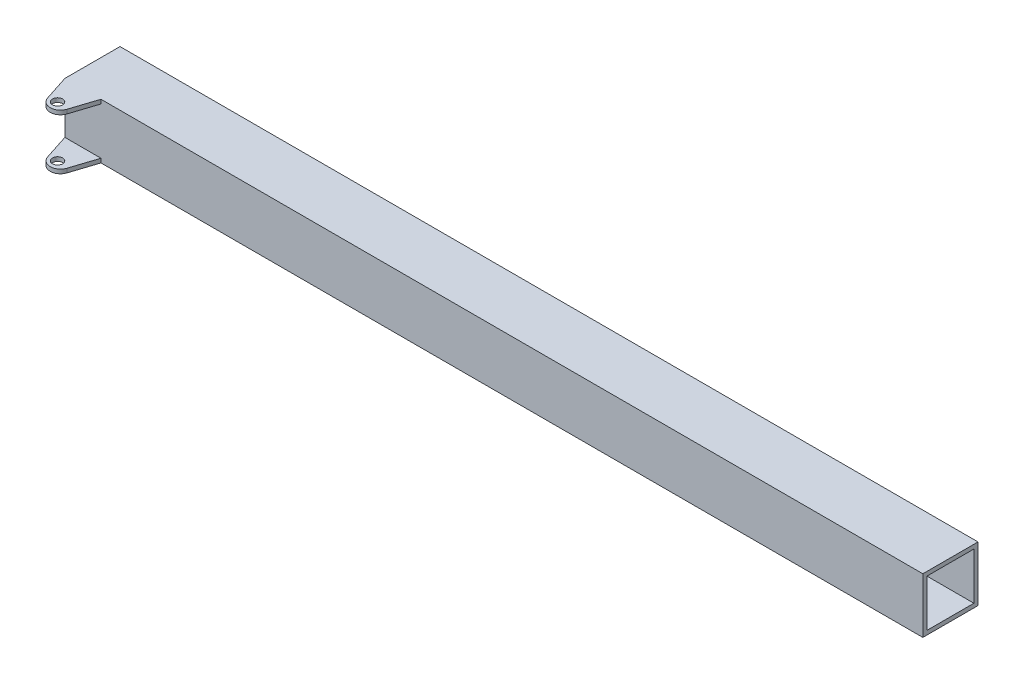
ISO-10303-21;
HEADER;
FILE_DESCRIPTION(('STEP AP214'),'2;1');
FILE_NAME('part.step','',(''),(''),'','','');
FILE_SCHEMA(('AUTOMOTIVE_DESIGN { 1 0 10303 214 1 1 1 1 }'));
ENDSEC;
DATA;
#1=APPLICATION_CONTEXT('core data for automotive mechanical design processes');
#2=APPLICATION_PROTOCOL_DEFINITION('international standard','automotive_design',2000,#1);
#3=PRODUCT_CONTEXT('',#1,'mechanical');
#4=PRODUCT('Part','Part','',(#3));
#5=PRODUCT_RELATED_PRODUCT_CATEGORY('part','',(#4));
#6=PRODUCT_DEFINITION_FORMATION('','',#4);
#7=PRODUCT_DEFINITION_CONTEXT('part definition',#1,'design');
#8=PRODUCT_DEFINITION('design','',#6,#7);
#9=PRODUCT_DEFINITION_SHAPE('','',#8);
#10=(LENGTH_UNIT() NAMED_UNIT(*) SI_UNIT(.MILLI.,.METRE.));
#11=(NAMED_UNIT(*) PLANE_ANGLE_UNIT() SI_UNIT($,.RADIAN.));
#12=(NAMED_UNIT(*) SI_UNIT($,.STERADIAN.) SOLID_ANGLE_UNIT());
#13=UNCERTAINTY_MEASURE_WITH_UNIT(LENGTH_MEASURE(1.E-05),#10,'distance_accuracy_value','');
#14=(GEOMETRIC_REPRESENTATION_CONTEXT(3) GLOBAL_UNCERTAINTY_ASSIGNED_CONTEXT((#13)) GLOBAL_UNIT_ASSIGNED_CONTEXT((#10,
#11,#12)) REPRESENTATION_CONTEXT('',''));
#15=CARTESIAN_POINT('',(0.,0.,0.));
#16=DIRECTION('',(0.,0.,1.));
#17=DIRECTION('',(1.,0.,0.));
#18=AXIS2_PLACEMENT_3D('',#15,#16,#17);
#19=CARTESIAN_POINT('',(-4200.,270.,135.));
#20=DIRECTION('',(0.,1.,0.));
#21=DIRECTION('',(0.,0.,1.));
#22=AXIS2_PLACEMENT_3D('',#19,#20,#21);
#23=PLANE('',#22);
#24=DIRECTION('',(0.,0.,1.));
#25=VECTOR('',#24,1.);
#26=CARTESIAN_POINT('',(0.,270.,135.));
#27=LINE('',#26,#25);
#28=CARTESIAN_POINT('',(0.,270.,-135.));
#29=VERTEX_POINT('',#28);
#30=CARTESIAN_POINT('',(0.,270.,135.));
#31=VERTEX_POINT('',#30);
#32=EDGE_CURVE('E237',#29,#31,#27,.T.);
#33=ORIENTED_EDGE('',*,*,#32,.F.);
#34=DIRECTION('',(1.,0.,0.));
#35=VECTOR('',#34,1.);
#36=CARTESIAN_POINT('',(-4200.,270.,-135.));
#37=LINE('',#36,#35);
#38=CARTESIAN_POINT('',(-4200.,270.,-135.));
#39=VERTEX_POINT('',#38);
#40=EDGE_CURVE('E11',#39,#29,#37,.T.);
#41=ORIENTED_EDGE('',*,*,#40,.F.);
#42=DIRECTION('',(0.,0.,1.));
#43=VECTOR('',#42,1.);
#44=CARTESIAN_POINT('',(-4200.,270.,135.));
#45=LINE('',#44,#43);
#46=CARTESIAN_POINT('',(-4200.,270.,135.));
#47=VERTEX_POINT('',#46);
#48=EDGE_CURVE('E244',#39,#47,#45,.T.);
#49=ORIENTED_EDGE('',*,*,#48,.T.);
#50=DIRECTION('',(0.309449516810996,0.,0.950915872485806));
#51=VECTOR('',#50,1.);
#52=CARTESIAN_POINT('',(-4159.16842052448,270.,260.47247584055));
#53=LINE('',#52,#51);
#54=CARTESIAN_POINT('',(-4159.16842052448,270.,260.47247584055));
#55=VERTEX_POINT('',#54);
#56=EDGE_CURVE('E170',#47,#55,#53,.T.);
#57=ORIENTED_EDGE('',*,*,#56,.T.);
#58=CARTESIAN_POINT('',(-4111.62262690019,270.,245.));
#59=DIRECTION('',(0.,1.,0.));
#60=DIRECTION('',(0.,0.,1.));
#61=AXIS2_PLACEMENT_3D('',#58,#59,#60);
#62=CIRCLE('',#61,50.);
#63=CARTESIAN_POINT('',(-4064.0768332759,270.,260.47247584055));
#64=VERTEX_POINT('',#63);
#65=EDGE_CURVE('E167',#55,#64,#62,.T.);
#66=ORIENTED_EDGE('',*,*,#65,.T.);
#67=DIRECTION('',(0.309449516810996,0.,-0.950915872485806));
#68=VECTOR('',#67,1.);
#69=CARTESIAN_POINT('',(-4023.24525380038,270.,135.));
#70=LINE('',#69,#68);
#71=CARTESIAN_POINT('',(-4023.24525380038,270.,135.));
#72=VERTEX_POINT('',#71);
#73=EDGE_CURVE('E145',#64,#72,#70,.T.);
#74=ORIENTED_EDGE('',*,*,#73,.T.);
#75=DIRECTION('',(1.,0.,0.));
#76=VECTOR('',#75,1.);
#77=CARTESIAN_POINT('',(-4200.,270.,135.));
#78=LINE('',#77,#76);
#79=EDGE_CURVE('E55',#72,#31,#78,.T.);
#80=ORIENTED_EDGE('',*,*,#79,.T.);
#81=EDGE_LOOP('',(#33,#41,#49,#57,#66,#74,#80));
#82=FACE_BOUND('',#81,.T.);
#83=CARTESIAN_POINT('',(-4118.21652714491,270.,252.56));
#84=DIRECTION('',(0.,1.,0.));
#85=DIRECTION('',(0.,0.,1.));
#86=AXIS2_PLACEMENT_3D('',#83,#84,#85);
#87=CIRCLE('',#86,25.0000000000005);
#88=CARTESIAN_POINT('',(-4118.21652714491,270.,277.560000000001));
#89=VERTEX_POINT('',#88);
#90=EDGE_CURVE('E400',#89,#89,#87,.T.);
#91=ORIENTED_EDGE('',*,*,#90,.F.);
#92=EDGE_LOOP('',(#91));
#93=FACE_BOUND('',#92,.T.);
#94=ADVANCED_FACE('F34',(#82,#93),#23,.T.);
#95=CARTESIAN_POINT('',(-4200.,270.,-135.));
#96=DIRECTION('',(0.,0.,-1.));
#97=DIRECTION('',(0.,1.,0.));
#98=AXIS2_PLACEMENT_3D('',#95,#96,#97);
#99=PLANE('',#98);
#100=DIRECTION('',(0.,1.,0.));
#101=VECTOR('',#100,1.);
#102=CARTESIAN_POINT('',(0.,270.,-135.));
#103=LINE('',#102,#101);
#104=CARTESIAN_POINT('',(0.,0.,-135.));
#105=VERTEX_POINT('',#104);
#106=EDGE_CURVE('E248',#105,#29,#103,.T.);
#107=ORIENTED_EDGE('',*,*,#106,.F.);
#108=DIRECTION('',(1.,0.,0.));
#109=VECTOR('',#108,1.);
#110=CARTESIAN_POINT('',(-4200.,0.,-135.));
#111=LINE('',#110,#109);
#112=CARTESIAN_POINT('',(-4200.,0.,-135.));
#113=VERTEX_POINT('',#112);
#114=EDGE_CURVE('E42',#113,#105,#111,.T.);
#115=ORIENTED_EDGE('',*,*,#114,.F.);
#116=DIRECTION('',(0.,1.,0.));
#117=VECTOR('',#116,1.);
#118=CARTESIAN_POINT('',(-4200.,270.,-135.));
#119=LINE('',#118,#117);
#120=EDGE_CURVE('E255',#113,#39,#119,.T.);
#121=ORIENTED_EDGE('',*,*,#120,.T.);
#122=ORIENTED_EDGE('',*,*,#40,.T.);
#123=EDGE_LOOP('',(#107,#115,#121,#122));
#124=FACE_BOUND('',#123,.T.);
#125=ADVANCED_FACE('F280',(#124),#99,.T.);
#126=CARTESIAN_POINT('',(-4200.,0.,-135.));
#127=DIRECTION('',(0.,-1.,0.));
#128=DIRECTION('',(0.,0.,-1.));
#129=AXIS2_PLACEMENT_3D('',#126,#127,#128);
#130=PLANE('',#129);
#131=DIRECTION('',(0.,0.,-1.));
#132=VECTOR('',#131,1.);
#133=CARTESIAN_POINT('',(0.,0.,-135.));
#134=LINE('',#133,#132);
#135=CARTESIAN_POINT('',(0.,0.,135.));
#136=VERTEX_POINT('',#135);
#137=EDGE_CURVE('E263',#136,#105,#134,.T.);
#138=ORIENTED_EDGE('',*,*,#137,.F.);
#139=DIRECTION('',(1.,0.,0.));
#140=VECTOR('',#139,1.);
#141=CARTESIAN_POINT('',(-4200.,0.,135.));
#142=LINE('',#141,#140);
#143=CARTESIAN_POINT('',(-4023.24525380038,0.,135.));
#144=VERTEX_POINT('',#143);
#145=EDGE_CURVE('E269',#144,#136,#142,.T.);
#146=ORIENTED_EDGE('',*,*,#145,.F.);
#147=DIRECTION('',(0.309449516810996,0.,-0.950915872485806));
#148=VECTOR('',#147,1.);
#149=CARTESIAN_POINT('',(-4023.24525380038,0.,135.));
#150=LINE('',#149,#148);
#151=CARTESIAN_POINT('',(-4064.0768332759,0.,260.47247584055));
#152=VERTEX_POINT('',#151);
#153=EDGE_CURVE('E186',#152,#144,#150,.T.);
#154=ORIENTED_EDGE('',*,*,#153,.F.);
#155=CARTESIAN_POINT('',(-4111.62262690019,0.,245.));
#156=DIRECTION('',(0.,1.,0.));
#157=DIRECTION('',(0.,0.,1.));
#158=AXIS2_PLACEMENT_3D('',#155,#156,#157);
#159=CIRCLE('',#158,50.);
#160=CARTESIAN_POINT('',(-4159.16842052448,0.,260.47247584055));
#161=VERTEX_POINT('',#160);
#162=EDGE_CURVE('E194',#161,#152,#159,.T.);
#163=ORIENTED_EDGE('',*,*,#162,.F.);
#164=DIRECTION('',(0.309449516810996,0.,0.950915872485806));
#165=VECTOR('',#164,1.);
#166=CARTESIAN_POINT('',(-4159.16842052448,0.,260.47247584055));
#167=LINE('',#166,#165);
#168=CARTESIAN_POINT('',(-4200.,0.,135.));
#169=VERTEX_POINT('',#168);
#170=EDGE_CURVE('E179',#169,#161,#167,.T.);
#171=ORIENTED_EDGE('',*,*,#170,.F.);
#172=DIRECTION('',(0.,0.,-1.));
#173=VECTOR('',#172,1.);
#174=CARTESIAN_POINT('',(-4200.,0.,-135.));
#175=LINE('',#174,#173);
#176=EDGE_CURVE('E252',#169,#113,#175,.T.);
#177=ORIENTED_EDGE('',*,*,#176,.T.);
#178=ORIENTED_EDGE('',*,*,#114,.T.);
#179=EDGE_LOOP('',(#138,#146,#154,#163,#171,#177,#178));
#180=FACE_BOUND('',#179,.T.);
#181=CARTESIAN_POINT('',(-4118.21652714491,0.,252.56));
#182=DIRECTION('',(0.,1.,0.));
#183=DIRECTION('',(0.,0.,1.));
#184=AXIS2_PLACEMENT_3D('',#181,#182,#183);
#185=CIRCLE('',#184,25.0000000000005);
#186=CARTESIAN_POINT('',(-4118.21652714491,0.,277.560000000001));
#187=VERTEX_POINT('',#186);
#188=EDGE_CURVE('E175',#187,#187,#185,.T.);
#189=ORIENTED_EDGE('',*,*,#188,.T.);
#190=EDGE_LOOP('',(#189));
#191=FACE_BOUND('',#190,.T.);
#192=ADVANCED_FACE('F304',(#180,#191),#130,.T.);
#193=CARTESIAN_POINT('',(-4200.,270.,135.));
#194=DIRECTION('',(0.,0.,1.));
#195=DIRECTION('',(0.,-1.,0.));
#196=AXIS2_PLACEMENT_3D('',#193,#194,#195);
#197=PLANE('',#196);
#198=DIRECTION('',(0.,1.,0.));
#199=VECTOR('',#198,1.);
#200=CARTESIAN_POINT('',(-4023.24525380038,250.,135.));
#201=LINE('',#200,#199);
#202=CARTESIAN_POINT('',(-4023.24525380038,250.,135.));
#203=VERTEX_POINT('',#202);
#204=EDGE_CURVE('E50',#203,#72,#201,.T.);
#205=ORIENTED_EDGE('',*,*,#204,.F.);
#206=DIRECTION('',(-1.,0.,0.));
#207=VECTOR('',#206,1.);
#208=CARTESIAN_POINT('',(-4200.,250.,135.));
#209=LINE('',#208,#207);
#210=CARTESIAN_POINT('',(-4200.,250.,135.));
#211=VERTEX_POINT('',#210);
#212=EDGE_CURVE('E158',#203,#211,#209,.T.);
#213=ORIENTED_EDGE('',*,*,#212,.T.);
#214=DIRECTION('',(0.,-1.,0.));
#215=VECTOR('',#214,1.);
#216=CARTESIAN_POINT('',(-4200.,270.,135.));
#217=LINE('',#216,#215);
#218=CARTESIAN_POINT('',(-4200.,20.,135.));
#219=VERTEX_POINT('',#218);
#220=EDGE_CURVE('E247',#211,#219,#217,.T.);
#221=ORIENTED_EDGE('',*,*,#220,.T.);
#222=DIRECTION('',(-1.,0.,0.));
#223=VECTOR('',#222,1.);
#224=CARTESIAN_POINT('',(-4200.,20.,135.));
#225=LINE('',#224,#223);
#226=CARTESIAN_POINT('',(-4023.24525380038,20.,135.));
#227=VERTEX_POINT('',#226);
#228=EDGE_CURVE('E182',#227,#219,#225,.T.);
#229=ORIENTED_EDGE('',*,*,#228,.F.);
#230=DIRECTION('',(0.,-1.,0.));
#231=VECTOR('',#230,1.);
#232=CARTESIAN_POINT('',(-4023.24525380038,20.,135.));
#233=LINE('',#232,#231);
#234=EDGE_CURVE('E192',#227,#144,#233,.T.);
#235=ORIENTED_EDGE('',*,*,#234,.T.);
#236=ORIENTED_EDGE('',*,*,#145,.T.);
#237=DIRECTION('',(0.,-1.,0.));
#238=VECTOR('',#237,1.);
#239=CARTESIAN_POINT('',(0.,270.,135.));
#240=LINE('',#239,#238);
#241=EDGE_CURVE('E260',#31,#136,#240,.T.);
#242=ORIENTED_EDGE('',*,*,#241,.F.);
#243=ORIENTED_EDGE('',*,*,#79,.F.);
#244=EDGE_LOOP('',(#205,#213,#221,#229,#235,#236,#242,#243));
#245=FACE_BOUND('',#244,.T.);
#246=ADVANCED_FACE('F273',(#245),#197,.T.);
#247=CARTESIAN_POINT('',(-4200.,0.,0.));
#248=DIRECTION('',(-1.,0.,0.));
#249=DIRECTION('',(0.,0.,1.));
#250=AXIS2_PLACEMENT_3D('',#247,#248,#249);
#251=PLANE('',#250);
#252=DIRECTION('',(0.,-1.,0.));
#253=VECTOR('',#252,1.);
#254=CARTESIAN_POINT('',(-4200.,250.,115.));
#255=LINE('',#254,#253);
#256=CARTESIAN_POINT('',(-4200.,250.,115.));
#257=VERTEX_POINT('',#256);
#258=CARTESIAN_POINT('',(-4200.,19.9999999999997,115.));
#259=VERTEX_POINT('',#258);
#260=EDGE_CURVE('E212',#257,#259,#255,.T.);
#261=ORIENTED_EDGE('',*,*,#260,.T.);
#262=DIRECTION('',(0.,0.,-1.));
#263=VECTOR('',#262,1.);
#264=CARTESIAN_POINT('',(-4200.,19.9999999999997,115.));
#265=LINE('',#264,#263);
#266=CARTESIAN_POINT('',(-4200.,19.9999999999997,-115.));
#267=VERTEX_POINT('',#266);
#268=EDGE_CURVE('E215',#259,#267,#265,.T.);
#269=ORIENTED_EDGE('',*,*,#268,.T.);
#270=DIRECTION('',(0.,1.,0.));
#271=VECTOR('',#270,1.);
#272=CARTESIAN_POINT('',(-4200.,250.,-115.));
#273=LINE('',#272,#271);
#274=CARTESIAN_POINT('',(-4200.,250.,-115.));
#275=VERTEX_POINT('',#274);
#276=EDGE_CURVE('E219',#267,#275,#273,.T.);
#277=ORIENTED_EDGE('',*,*,#276,.T.);
#278=DIRECTION('',(0.,0.,1.));
#279=VECTOR('',#278,1.);
#280=CARTESIAN_POINT('',(-4200.,250.,115.));
#281=LINE('',#280,#279);
#282=EDGE_CURVE('E222',#275,#257,#281,.T.);
#283=ORIENTED_EDGE('',*,*,#282,.T.);
#284=EDGE_LOOP('',(#261,#269,#277,#283));
#285=FACE_BOUND('',#284,.T.);
#286=ORIENTED_EDGE('',*,*,#48,.F.);
#287=ORIENTED_EDGE('',*,*,#120,.F.);
#288=ORIENTED_EDGE('',*,*,#176,.F.);
#289=DIRECTION('',(0.,-1.,0.));
#290=VECTOR('',#289,1.);
#291=CARTESIAN_POINT('',(-4200.,20.,135.));
#292=LINE('',#291,#290);
#293=EDGE_CURVE('E205',#219,#169,#292,.T.);
#294=ORIENTED_EDGE('',*,*,#293,.F.);
#295=ORIENTED_EDGE('',*,*,#220,.F.);
#296=EDGE_CURVE('E249',#47,#211,#217,.T.);
#297=ORIENTED_EDGE('',*,*,#296,.F.);
#298=EDGE_LOOP('',(#286,#287,#288,#294,#295,#297));
#299=FACE_BOUND('',#298,.T.);
#300=ADVANCED_FACE('F285',(#285,#299),#251,.T.);
#301=CARTESIAN_POINT('',(0.,0.,0.));
#302=DIRECTION('',(-1.,0.,0.));
#303=DIRECTION('',(0.,0.,1.));
#304=AXIS2_PLACEMENT_3D('',#301,#302,#303);
#305=PLANE('',#304);
#306=DIRECTION('',(0.,0.,-1.));
#307=VECTOR('',#306,1.);
#308=CARTESIAN_POINT('',(0.,19.9999999999997,115.));
#309=LINE('',#308,#307);
#310=CARTESIAN_POINT('',(0.,19.9999999999997,115.));
#311=VERTEX_POINT('',#310);
#312=CARTESIAN_POINT('',(0.,19.9999999999997,-115.));
#313=VERTEX_POINT('',#312);
#314=EDGE_CURVE('E227',#311,#313,#309,.T.);
#315=ORIENTED_EDGE('',*,*,#314,.F.);
#316=DIRECTION('',(0.,-1.,0.));
#317=VECTOR('',#316,1.);
#318=CARTESIAN_POINT('',(0.,250.,115.));
#319=LINE('',#318,#317);
#320=CARTESIAN_POINT('',(0.,250.,115.));
#321=VERTEX_POINT('',#320);
#322=EDGE_CURVE('E211',#321,#311,#319,.T.);
#323=ORIENTED_EDGE('',*,*,#322,.F.);
#324=DIRECTION('',(0.,0.,1.));
#325=VECTOR('',#324,1.);
#326=CARTESIAN_POINT('',(0.,250.,115.));
#327=LINE('',#326,#325);
#328=CARTESIAN_POINT('',(0.,250.,-115.));
#329=VERTEX_POINT('',#328);
#330=EDGE_CURVE('E216',#329,#321,#327,.T.);
#331=ORIENTED_EDGE('',*,*,#330,.F.);
#332=DIRECTION('',(0.,1.,0.));
#333=VECTOR('',#332,1.);
#334=CARTESIAN_POINT('',(0.,250.,-115.));
#335=LINE('',#334,#333);
#336=EDGE_CURVE('E230',#313,#329,#335,.T.);
#337=ORIENTED_EDGE('',*,*,#336,.F.);
#338=EDGE_LOOP('',(#315,#323,#331,#337));
#339=FACE_BOUND('',#338,.T.);
#340=ORIENTED_EDGE('',*,*,#32,.T.);
#341=ORIENTED_EDGE('',*,*,#241,.T.);
#342=ORIENTED_EDGE('',*,*,#137,.T.);
#343=ORIENTED_EDGE('',*,*,#106,.T.);
#344=EDGE_LOOP('',(#340,#341,#342,#343));
#345=FACE_BOUND('',#344,.T.);
#346=ADVANCED_FACE('F277',(#339,#345),#305,.F.);
#347=CARTESIAN_POINT('',(-4200.,250.,115.));
#348=DIRECTION('',(0.,0.,1.));
#349=DIRECTION('',(0.,-1.,0.));
#350=AXIS2_PLACEMENT_3D('',#347,#348,#349);
#351=PLANE('',#350);
#352=ORIENTED_EDGE('',*,*,#322,.T.);
#353=DIRECTION('',(1.,0.,0.));
#354=VECTOR('',#353,1.);
#355=CARTESIAN_POINT('',(-4200.,19.9999999999997,115.));
#356=LINE('',#355,#354);
#357=EDGE_CURVE('E225',#259,#311,#356,.T.);
#358=ORIENTED_EDGE('',*,*,#357,.F.);
#359=ORIENTED_EDGE('',*,*,#260,.F.);
#360=DIRECTION('',(1.,0.,0.));
#361=VECTOR('',#360,1.);
#362=CARTESIAN_POINT('',(-4200.,250.,115.));
#363=LINE('',#362,#361);
#364=EDGE_CURVE('E235',#257,#321,#363,.T.);
#365=ORIENTED_EDGE('',*,*,#364,.T.);
#366=EDGE_LOOP('',(#352,#358,#359,#365));
#367=FACE_BOUND('',#366,.T.);
#368=ADVANCED_FACE('F321',(#367),#351,.F.);
#369=CARTESIAN_POINT('',(-4200.,250.,115.));
#370=DIRECTION('',(0.,1.,0.));
#371=DIRECTION('',(0.,0.,1.));
#372=AXIS2_PLACEMENT_3D('',#369,#370,#371);
#373=PLANE('',#372);
#374=CARTESIAN_POINT('',(-200.,250.,0.));
#375=DIRECTION('',(0.,1.,0.));
#376=DIRECTION('',(0.,0.,1.));
#377=AXIS2_PLACEMENT_3D('',#374,#375,#376);
#378=CIRCLE('',#377,25.);
#379=CARTESIAN_POINT('',(-200.,250.,25.));
#380=VERTEX_POINT('',#379);
#381=EDGE_CURVE('E208',#380,#380,#378,.T.);
#382=ORIENTED_EDGE('',*,*,#381,.T.);
#383=EDGE_LOOP('',(#382));
#384=FACE_BOUND('',#383,.T.);
#385=ORIENTED_EDGE('',*,*,#330,.T.);
#386=ORIENTED_EDGE('',*,*,#364,.F.);
#387=ORIENTED_EDGE('',*,*,#282,.F.);
#388=DIRECTION('',(1.,0.,0.));
#389=VECTOR('',#388,1.);
#390=CARTESIAN_POINT('',(-4200.,250.,-115.));
#391=LINE('',#390,#389);
#392=EDGE_CURVE('E238',#275,#329,#391,.T.);
#393=ORIENTED_EDGE('',*,*,#392,.T.);
#394=EDGE_LOOP('',(#385,#386,#387,#393));
#395=FACE_BOUND('',#394,.T.);
#396=ADVANCED_FACE('F326',(#384,#395),#373,.F.);
#397=CARTESIAN_POINT('',(-4200.,250.,-115.));
#398=DIRECTION('',(0.,0.,-1.));
#399=DIRECTION('',(0.,1.,0.));
#400=AXIS2_PLACEMENT_3D('',#397,#398,#399);
#401=PLANE('',#400);
#402=ORIENTED_EDGE('',*,*,#336,.T.);
#403=ORIENTED_EDGE('',*,*,#392,.F.);
#404=ORIENTED_EDGE('',*,*,#276,.F.);
#405=DIRECTION('',(1.,0.,0.));
#406=VECTOR('',#405,1.);
#407=CARTESIAN_POINT('',(-4200.,19.9999999999997,-115.));
#408=LINE('',#407,#406);
#409=EDGE_CURVE('E240',#267,#313,#408,.T.);
#410=ORIENTED_EDGE('',*,*,#409,.T.);
#411=EDGE_LOOP('',(#402,#403,#404,#410));
#412=FACE_BOUND('',#411,.T.);
#413=ADVANCED_FACE('F332',(#412),#401,.F.);
#414=CARTESIAN_POINT('',(-4200.,19.9999999999997,115.));
#415=DIRECTION('',(0.,-1.,0.));
#416=DIRECTION('',(0.,0.,-1.));
#417=AXIS2_PLACEMENT_3D('',#414,#415,#416);
#418=PLANE('',#417);
#419=CARTESIAN_POINT('',(-200.,19.9999999999997,0.));
#420=DIRECTION('',(0.,-1.,0.));
#421=DIRECTION('',(0.,0.,-1.));
#422=AXIS2_PLACEMENT_3D('',#419,#420,#421);
#423=CIRCLE('',#422,25.);
#424=CARTESIAN_POINT('',(-200.,19.9999999999997,-25.));
#425=VERTEX_POINT('',#424);
#426=EDGE_CURVE('E37',#425,#425,#423,.T.);
#427=ORIENTED_EDGE('',*,*,#426,.T.);
#428=EDGE_LOOP('',(#427));
#429=FACE_BOUND('',#428,.T.);
#430=ORIENTED_EDGE('',*,*,#314,.T.);
#431=ORIENTED_EDGE('',*,*,#409,.F.);
#432=ORIENTED_EDGE('',*,*,#268,.F.);
#433=ORIENTED_EDGE('',*,*,#357,.T.);
#434=EDGE_LOOP('',(#430,#431,#432,#433));
#435=FACE_BOUND('',#434,.T.);
#436=ADVANCED_FACE('F328',(#429,#435),#418,.F.);
#437=CARTESIAN_POINT('',(-200.,270.,0.));
#438=DIRECTION('',(0.,-1.,0.));
#439=DIRECTION('',(0.,0.,-1.));
#440=AXIS2_PLACEMENT_3D('',#437,#438,#439);
#441=CYLINDRICAL_SURFACE('',#440,25.);
#442=ORIENTED_EDGE('',*,*,#426,.F.);
#443=EDGE_LOOP('',(#442));
#444=FACE_BOUND('',#443,.T.);
#445=ORIENTED_EDGE('',*,*,#381,.F.);
#446=EDGE_LOOP('',(#445));
#447=FACE_BOUND('',#446,.T.);
#448=ADVANCED_FACE('F331',(#444,#447),#441,.T.);
#449=CARTESIAN_POINT('',(-4111.62262690019,20.,245.));
#450=DIRECTION('',(0.,1.,0.));
#451=DIRECTION('',(0.,0.,1.));
#452=AXIS2_PLACEMENT_3D('',#449,#450,#451);
#453=PLANE('',#452);
#454=ORIENTED_EDGE('',*,*,#228,.T.);
#455=DIRECTION('',(0.309449516810996,0.,0.950915872485806));
#456=VECTOR('',#455,1.);
#457=CARTESIAN_POINT('',(-4159.16842052448,20.,260.47247584055));
#458=LINE('',#457,#456);
#459=CARTESIAN_POINT('',(-4159.16842052448,20.,260.47247584055));
#460=VERTEX_POINT('',#459);
#461=EDGE_CURVE('E185',#219,#460,#458,.T.);
#462=ORIENTED_EDGE('',*,*,#461,.T.);
#463=CARTESIAN_POINT('',(-4111.62262690019,20.,245.));
#464=DIRECTION('',(0.,1.,0.));
#465=DIRECTION('',(0.,0.,1.));
#466=AXIS2_PLACEMENT_3D('',#463,#464,#465);
#467=CIRCLE('',#466,50.);
#468=CARTESIAN_POINT('',(-4064.0768332759,20.,260.47247584055));
#469=VERTEX_POINT('',#468);
#470=EDGE_CURVE('E188',#460,#469,#467,.T.);
#471=ORIENTED_EDGE('',*,*,#470,.T.);
#472=DIRECTION('',(0.309449516810996,0.,-0.950915872485806));
#473=VECTOR('',#472,1.);
#474=CARTESIAN_POINT('',(-4023.24525380038,20.,135.));
#475=LINE('',#474,#473);
#476=EDGE_CURVE('E190',#469,#227,#475,.T.);
#477=ORIENTED_EDGE('',*,*,#476,.T.);
#478=EDGE_LOOP('',(#454,#462,#471,#477));
#479=FACE_BOUND('',#478,.T.);
#480=CARTESIAN_POINT('',(-4118.21652714491,20.,252.56));
#481=DIRECTION('',(0.,1.,0.));
#482=DIRECTION('',(0.,0.,1.));
#483=AXIS2_PLACEMENT_3D('',#480,#481,#482);
#484=CIRCLE('',#483,25.0000000000005);
#485=CARTESIAN_POINT('',(-4118.21652714491,20.,277.560000000001));
#486=VERTEX_POINT('',#485);
#487=EDGE_CURVE('E176',#486,#486,#484,.T.);
#488=ORIENTED_EDGE('',*,*,#487,.F.);
#489=EDGE_LOOP('',(#488));
#490=FACE_BOUND('',#489,.T.);
#491=ADVANCED_FACE('F342',(#479,#490),#453,.T.);
#492=CARTESIAN_POINT('',(-4159.16842052448,20.,260.47247584055));
#493=DIRECTION('',(0.950915872485806,0.,-0.309449516810996));
#494=DIRECTION('',(-0.309449516810996,0.,-0.950915872485806));
#495=AXIS2_PLACEMENT_3D('',#492,#493,#494);
#496=PLANE('',#495);
#497=ORIENTED_EDGE('',*,*,#170,.T.);
#498=DIRECTION('',(0.,-1.,0.));
#499=VECTOR('',#498,1.);
#500=CARTESIAN_POINT('',(-4159.16842052448,20.,260.47247584055));
#501=LINE('',#500,#499);
#502=EDGE_CURVE('E202',#460,#161,#501,.T.);
#503=ORIENTED_EDGE('',*,*,#502,.F.);
#504=ORIENTED_EDGE('',*,*,#461,.F.);
#505=ORIENTED_EDGE('',*,*,#293,.T.);
#506=EDGE_LOOP('',(#497,#503,#504,#505));
#507=FACE_BOUND('',#506,.T.);
#508=ADVANCED_FACE('F344',(#507),#496,.F.);
#509=CARTESIAN_POINT('',(-4111.62262690019,20.,245.));
#510=DIRECTION('',(0.,-1.,0.));
#511=DIRECTION('',(0.,0.,-1.));
#512=AXIS2_PLACEMENT_3D('',#509,#510,#511);
#513=CYLINDRICAL_SURFACE('',#512,50.);
#514=ORIENTED_EDGE('',*,*,#162,.T.);
#515=DIRECTION('',(0.,-1.,0.));
#516=VECTOR('',#515,1.);
#517=CARTESIAN_POINT('',(-4064.0768332759,20.,260.47247584055));
#518=LINE('',#517,#516);
#519=EDGE_CURVE('E199',#469,#152,#518,.T.);
#520=ORIENTED_EDGE('',*,*,#519,.F.);
#521=ORIENTED_EDGE('',*,*,#470,.F.);
#522=ORIENTED_EDGE('',*,*,#502,.T.);
#523=EDGE_LOOP('',(#514,#520,#521,#522));
#524=FACE_BOUND('',#523,.T.);
#525=ADVANCED_FACE('F347',(#524),#513,.T.);
#526=CARTESIAN_POINT('',(-4023.24525380038,20.,135.));
#527=DIRECTION('',(-0.950915872485806,0.,-0.309449516810996));
#528=DIRECTION('',(-0.309449516810996,0.,0.950915872485806));
#529=AXIS2_PLACEMENT_3D('',#526,#527,#528);
#530=PLANE('',#529);
#531=ORIENTED_EDGE('',*,*,#153,.T.);
#532=ORIENTED_EDGE('',*,*,#234,.F.);
#533=ORIENTED_EDGE('',*,*,#476,.F.);
#534=ORIENTED_EDGE('',*,*,#519,.T.);
#535=EDGE_LOOP('',(#531,#532,#533,#534));
#536=FACE_BOUND('',#535,.T.);
#537=ADVANCED_FACE('F351',(#536),#530,.F.);
#538=CARTESIAN_POINT('',(-4118.21652714491,20.,252.56));
#539=DIRECTION('',(0.,-1.,0.));
#540=DIRECTION('',(0.,0.,-1.));
#541=AXIS2_PLACEMENT_3D('',#538,#539,#540);
#542=CYLINDRICAL_SURFACE('',#541,25.0000000000005);
#543=ORIENTED_EDGE('',*,*,#487,.T.);
#544=EDGE_LOOP('',(#543));
#545=FACE_BOUND('',#544,.T.);
#546=ORIENTED_EDGE('',*,*,#188,.F.);
#547=EDGE_LOOP('',(#546));
#548=FACE_BOUND('',#547,.T.);
#549=ADVANCED_FACE('F355',(#545,#548),#542,.F.);
#550=CARTESIAN_POINT('',(-4023.24525380038,250.,135.));
#551=DIRECTION('',(0.950915872485806,0.,0.309449516810996));
#552=DIRECTION('',(0.309449516810996,0.,-0.950915872485806));
#553=AXIS2_PLACEMENT_3D('',#550,#551,#552);
#554=PLANE('',#553);
#555=ORIENTED_EDGE('',*,*,#73,.F.);
#556=DIRECTION('',(0.,1.,0.));
#557=VECTOR('',#556,1.);
#558=CARTESIAN_POINT('',(-4064.0768332759,250.,260.47247584055));
#559=LINE('',#558,#557);
#560=CARTESIAN_POINT('',(-4064.0768332759,250.,260.47247584055));
#561=VERTEX_POINT('',#560);
#562=EDGE_CURVE('E140',#561,#64,#559,.T.);
#563=ORIENTED_EDGE('',*,*,#562,.F.);
#564=DIRECTION('',(0.309449516810996,0.,-0.950915872485806));
#565=VECTOR('',#564,1.);
#566=CARTESIAN_POINT('',(-4023.24525380038,250.,135.));
#567=LINE('',#566,#565);
#568=EDGE_CURVE('E143',#561,#203,#567,.T.);
#569=ORIENTED_EDGE('',*,*,#568,.T.);
#570=ORIENTED_EDGE('',*,*,#204,.T.);
#571=EDGE_LOOP('',(#555,#563,#569,#570));
#572=FACE_BOUND('',#571,.T.);
#573=ADVANCED_FACE('F142',(#572),#554,.T.);
#574=CARTESIAN_POINT('',(-4111.62262690019,250.,245.));
#575=DIRECTION('',(0.,1.,0.));
#576=DIRECTION('',(0.,0.,1.));
#577=AXIS2_PLACEMENT_3D('',#574,#575,#576);
#578=CYLINDRICAL_SURFACE('',#577,50.);
#579=ORIENTED_EDGE('',*,*,#65,.F.);
#580=DIRECTION('',(0.,1.,0.));
#581=VECTOR('',#580,1.);
#582=CARTESIAN_POINT('',(-4159.16842052448,250.,260.47247584055));
#583=LINE('',#582,#581);
#584=CARTESIAN_POINT('',(-4159.16842052448,250.,260.47247584055));
#585=VERTEX_POINT('',#584);
#586=EDGE_CURVE('E150',#585,#55,#583,.T.);
#587=ORIENTED_EDGE('',*,*,#586,.F.);
#588=CARTESIAN_POINT('',(-4111.62262690019,250.,245.));
#589=DIRECTION('',(0.,1.,0.));
#590=DIRECTION('',(0.,0.,1.));
#591=AXIS2_PLACEMENT_3D('',#588,#589,#590);
#592=CIRCLE('',#591,50.);
#593=EDGE_CURVE('E156',#585,#561,#592,.T.);
#594=ORIENTED_EDGE('',*,*,#593,.T.);
#595=ORIENTED_EDGE('',*,*,#562,.T.);
#596=EDGE_LOOP('',(#579,#587,#594,#595));
#597=FACE_BOUND('',#596,.T.);
#598=ADVANCED_FACE('F160',(#597),#578,.T.);
#599=CARTESIAN_POINT('',(-4159.16842052448,250.,260.47247584055));
#600=DIRECTION('',(-0.950915872485806,0.,0.309449516810996));
#601=DIRECTION('',(0.309449516810996,0.,0.950915872485806));
#602=AXIS2_PLACEMENT_3D('',#599,#600,#601);
#603=PLANE('',#602);
#604=ORIENTED_EDGE('',*,*,#56,.F.);
#605=ORIENTED_EDGE('',*,*,#296,.T.);
#606=DIRECTION('',(0.309449516810996,0.,0.950915872485806));
#607=VECTOR('',#606,1.);
#608=CARTESIAN_POINT('',(-4159.16842052448,250.,260.47247584055));
#609=LINE('',#608,#607);
#610=EDGE_CURVE('E161',#211,#585,#609,.T.);
#611=ORIENTED_EDGE('',*,*,#610,.T.);
#612=ORIENTED_EDGE('',*,*,#586,.T.);
#613=EDGE_LOOP('',(#604,#605,#611,#612));
#614=FACE_BOUND('',#613,.T.);
#615=ADVANCED_FACE('F289',(#614),#603,.T.);
#616=CARTESIAN_POINT('',(-4111.62262690019,250.,245.));
#617=DIRECTION('',(0.,-1.,0.));
#618=DIRECTION('',(0.,0.,1.));
#619=AXIS2_PLACEMENT_3D('',#616,#617,#618);
#620=PLANE('',#619);
#621=CARTESIAN_POINT('',(-4118.21652714491,250.,252.56));
#622=DIRECTION('',(0.,1.,0.));
#623=DIRECTION('',(0.,0.,1.));
#624=AXIS2_PLACEMENT_3D('',#621,#622,#623);
#625=CIRCLE('',#624,25.0000000000005);
#626=CARTESIAN_POINT('',(-4118.21652714491,250.,277.560000000001));
#627=VERTEX_POINT('',#626);
#628=EDGE_CURVE('E168',#627,#627,#625,.T.);
#629=ORIENTED_EDGE('',*,*,#628,.T.);
#630=EDGE_LOOP('',(#629));
#631=FACE_BOUND('',#630,.T.);
#632=ORIENTED_EDGE('',*,*,#212,.F.);
#633=ORIENTED_EDGE('',*,*,#568,.F.);
#634=ORIENTED_EDGE('',*,*,#593,.F.);
#635=ORIENTED_EDGE('',*,*,#610,.F.);
#636=EDGE_LOOP('',(#632,#633,#634,#635));
#637=FACE_BOUND('',#636,.T.);
#638=ADVANCED_FACE('F154',(#631,#637),#620,.T.);
#639=CARTESIAN_POINT('',(-4118.21652714491,250.,252.56));
#640=DIRECTION('',(0.,1.,0.));
#641=DIRECTION('',(0.,0.,1.));
#642=AXIS2_PLACEMENT_3D('',#639,#640,#641);
#643=CYLINDRICAL_SURFACE('',#642,25.0000000000005);
#644=ORIENTED_EDGE('',*,*,#628,.F.);
#645=EDGE_LOOP('',(#644));
#646=FACE_BOUND('',#645,.T.);
#647=ORIENTED_EDGE('',*,*,#90,.T.);
#648=EDGE_LOOP('',(#647));
#649=FACE_BOUND('',#648,.T.);
#650=ADVANCED_FACE('F296',(#646,#649),#643,.F.);
#651=CLOSED_SHELL('',(#94,#125,#192,#246,#300,#346,#368,#396,#413,#436,#448,#491,#508,#525,#537,
#549,#573,#598,#615,#638,#650));
#652=MANIFOLD_SOLID_BREP('B2',#651);
#653=ADVANCED_BREP_SHAPE_REPRESENTATION('',(#18,#652),#14);
#654=SHAPE_DEFINITION_REPRESENTATION(#9,#653);
ENDSEC;
END-ISO-10303-21;
